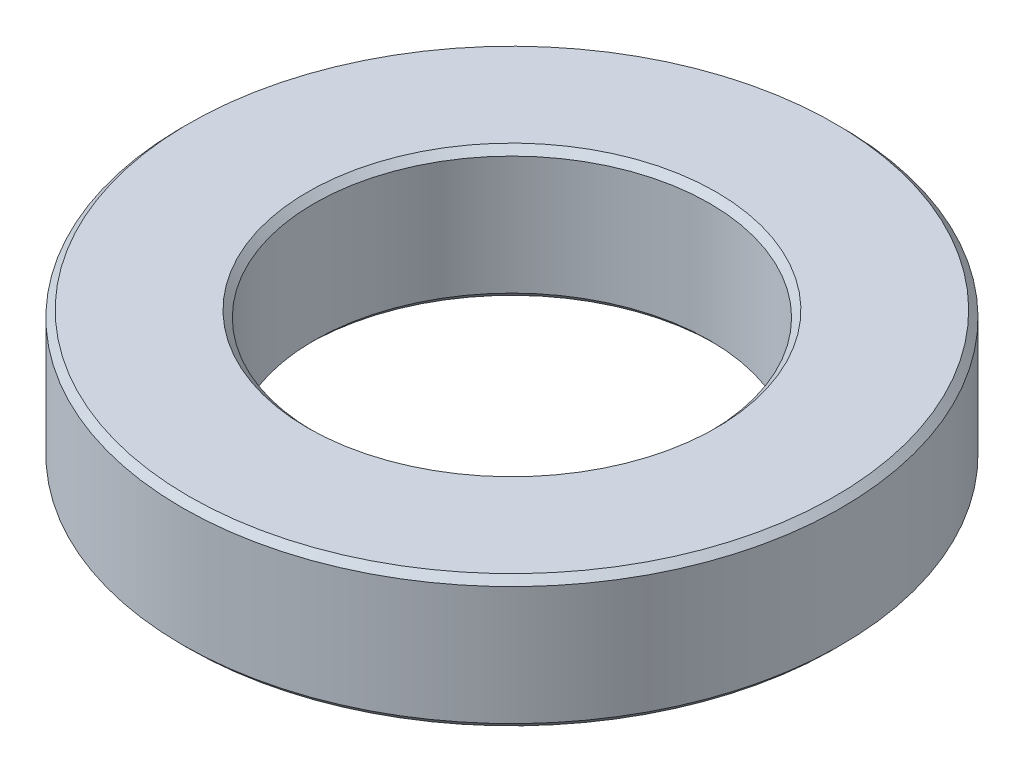
ISO-10303-21;
HEADER;
FILE_DESCRIPTION(('STEP AP214'),'2;1');
FILE_NAME('part.step','',(''),(''),'','','');
FILE_SCHEMA(('AUTOMOTIVE_DESIGN { 1 0 10303 214 1 1 1 1 }'));
ENDSEC;
DATA;
#1=APPLICATION_CONTEXT('core data for automotive mechanical design processes');
#2=APPLICATION_PROTOCOL_DEFINITION('international standard','automotive_design',2000,#1);
#3=PRODUCT_CONTEXT('',#1,'mechanical');
#4=PRODUCT('Part','Part','',(#3));
#5=PRODUCT_RELATED_PRODUCT_CATEGORY('part','',(#4));
#6=PRODUCT_DEFINITION_FORMATION('','',#4);
#7=PRODUCT_DEFINITION_CONTEXT('part definition',#1,'design');
#8=PRODUCT_DEFINITION('design','',#6,#7);
#9=PRODUCT_DEFINITION_SHAPE('','',#8);
#10=(LENGTH_UNIT() NAMED_UNIT(*) SI_UNIT(.MILLI.,.METRE.));
#11=(NAMED_UNIT(*) PLANE_ANGLE_UNIT() SI_UNIT($,.RADIAN.));
#12=(NAMED_UNIT(*) SI_UNIT($,.STERADIAN.) SOLID_ANGLE_UNIT());
#13=UNCERTAINTY_MEASURE_WITH_UNIT(LENGTH_MEASURE(1.E-05),#10,'distance_accuracy_value','');
#14=(GEOMETRIC_REPRESENTATION_CONTEXT(3) GLOBAL_UNCERTAINTY_ASSIGNED_CONTEXT((#13)) GLOBAL_UNIT_ASSIGNED_CONTEXT((#10,
#11,#12)) REPRESENTATION_CONTEXT('',''));
#15=CARTESIAN_POINT('',(0.,0.,0.));
#16=DIRECTION('',(0.,0.,1.));
#17=DIRECTION('',(1.,0.,0.));
#18=AXIS2_PLACEMENT_3D('',#15,#16,#17);
#19=CARTESIAN_POINT('',(0.,2.,0.));
#20=DIRECTION('',(0.,1.,0.));
#21=DIRECTION('',(0.,0.,1.));
#22=AXIS2_PLACEMENT_3D('',#19,#20,#21);
#23=PLANE('',#22);
#24=CARTESIAN_POINT('',(0.,2.,0.));
#25=DIRECTION('',(0.,1.,0.));
#26=DIRECTION('',(0.,0.,1.));
#27=AXIS2_PLACEMENT_3D('',#24,#25,#26);
#28=CIRCLE('',#27,3.1);
#29=CARTESIAN_POINT('',(0.,2.,3.1));
#30=VERTEX_POINT('',#29);
#31=EDGE_CURVE('E57',#30,#30,#28,.F.);
#32=ORIENTED_EDGE('',*,*,#31,.T.);
#33=EDGE_LOOP('',(#32));
#34=FACE_BOUND('',#33,.T.);
#35=CARTESIAN_POINT('',(0.,2.,0.));
#36=DIRECTION('',(0.,1.,0.));
#37=DIRECTION('',(0.,0.,1.));
#38=AXIS2_PLACEMENT_3D('',#35,#36,#37);
#39=CIRCLE('',#38,4.9);
#40=CARTESIAN_POINT('',(0.,2.,4.9));
#41=VERTEX_POINT('',#40);
#42=EDGE_CURVE('E61',#41,#41,#39,.T.);
#43=ORIENTED_EDGE('',*,*,#42,.T.);
#44=EDGE_LOOP('',(#43));
#45=FACE_BOUND('',#44,.T.);
#46=ADVANCED_FACE('F46',(#34,#45),#23,.T.);
#47=CARTESIAN_POINT('',(0.,0.,0.));
#48=DIRECTION('',(0.,1.,0.));
#49=DIRECTION('',(0.,0.,1.));
#50=AXIS2_PLACEMENT_3D('',#47,#48,#49);
#51=PLANE('',#50);
#52=CARTESIAN_POINT('',(0.,0.,0.));
#53=DIRECTION('',(0.,1.,0.));
#54=DIRECTION('',(0.,0.,1.));
#55=AXIS2_PLACEMENT_3D('',#52,#53,#54);
#56=CIRCLE('',#55,3.1);
#57=CARTESIAN_POINT('',(0.,0.,3.1));
#58=VERTEX_POINT('',#57);
#59=EDGE_CURVE('E72',#58,#58,#56,.T.);
#60=ORIENTED_EDGE('',*,*,#59,.T.);
#61=EDGE_LOOP('',(#60));
#62=FACE_BOUND('',#61,.T.);
#63=CARTESIAN_POINT('',(0.,0.,0.));
#64=DIRECTION('',(0.,1.,0.));
#65=DIRECTION('',(0.,0.,1.));
#66=AXIS2_PLACEMENT_3D('',#63,#64,#65);
#67=CIRCLE('',#66,4.9);
#68=CARTESIAN_POINT('',(0.,0.,4.9));
#69=VERTEX_POINT('',#68);
#70=EDGE_CURVE('E75',#69,#69,#67,.F.);
#71=ORIENTED_EDGE('',*,*,#70,.T.);
#72=EDGE_LOOP('',(#71));
#73=FACE_BOUND('',#72,.T.);
#74=ADVANCED_FACE('F79',(#62,#73),#51,.F.);
#75=CARTESIAN_POINT('',(0.,2.,0.));
#76=DIRECTION('',(0.,-1.,0.));
#77=DIRECTION('',(0.,0.,-1.));
#78=AXIS2_PLACEMENT_3D('',#75,#76,#77);
#79=CYLINDRICAL_SURFACE('',#78,5.);
#80=CARTESIAN_POINT('',(0.,0.0999999999999994,0.));
#81=DIRECTION('',(0.,1.,0.));
#82=DIRECTION('',(0.,0.,1.));
#83=AXIS2_PLACEMENT_3D('',#80,#81,#82);
#84=CIRCLE('',#83,5.);
#85=CARTESIAN_POINT('',(0.,0.0999999999999994,5.));
#86=VERTEX_POINT('',#85);
#87=EDGE_CURVE('E12',#86,#86,#84,.T.);
#88=ORIENTED_EDGE('',*,*,#87,.T.);
#89=EDGE_LOOP('',(#88));
#90=FACE_BOUND('',#89,.T.);
#91=CARTESIAN_POINT('',(0.,1.9,0.));
#92=DIRECTION('',(0.,1.,0.));
#93=DIRECTION('',(0.,0.,1.));
#94=AXIS2_PLACEMENT_3D('',#91,#92,#93);
#95=CIRCLE('',#94,5.);
#96=CARTESIAN_POINT('',(0.,1.9,5.));
#97=VERTEX_POINT('',#96);
#98=EDGE_CURVE('E53',#97,#97,#95,.F.);
#99=ORIENTED_EDGE('',*,*,#98,.T.);
#100=EDGE_LOOP('',(#99));
#101=FACE_BOUND('',#100,.T.);
#102=ADVANCED_FACE('F99',(#90,#101),#79,.T.);
#103=CARTESIAN_POINT('',(0.,2.,0.));
#104=DIRECTION('',(0.,-1.,0.));
#105=DIRECTION('',(0.,0.,-1.));
#106=AXIS2_PLACEMENT_3D('',#103,#104,#105);
#107=CYLINDRICAL_SURFACE('',#106,3.);
#108=CARTESIAN_POINT('',(0.,0.0999999999999985,0.));
#109=DIRECTION('',(0.,1.,0.));
#110=DIRECTION('',(0.,0.,1.));
#111=AXIS2_PLACEMENT_3D('',#108,#109,#110);
#112=CIRCLE('',#111,3.);
#113=CARTESIAN_POINT('',(0.,0.0999999999999985,3.));
#114=VERTEX_POINT('',#113);
#115=EDGE_CURVE('E66',#114,#114,#112,.F.);
#116=ORIENTED_EDGE('',*,*,#115,.T.);
#117=EDGE_LOOP('',(#116));
#118=FACE_BOUND('',#117,.T.);
#119=CARTESIAN_POINT('',(0.,1.9,0.));
#120=DIRECTION('',(0.,1.,0.));
#121=DIRECTION('',(0.,0.,1.));
#122=AXIS2_PLACEMENT_3D('',#119,#120,#121);
#123=CIRCLE('',#122,3.);
#124=CARTESIAN_POINT('',(0.,1.9,3.));
#125=VERTEX_POINT('',#124);
#126=EDGE_CURVE('E69',#125,#125,#123,.T.);
#127=ORIENTED_EDGE('',*,*,#126,.T.);
#128=EDGE_LOOP('',(#127));
#129=FACE_BOUND('',#128,.T.);
#130=ADVANCED_FACE('F104',(#118,#129),#107,.F.);
#131=CARTESIAN_POINT('',(0.,0.,0.));
#132=DIRECTION('',(0.,-1.,0.));
#133=DIRECTION('',(0.,0.,-1.));
#134=AXIS2_PLACEMENT_3D('',#131,#132,#133);
#135=CONICAL_SURFACE('',#134,3.1,0.785398163397448);
#136=ORIENTED_EDGE('',*,*,#115,.F.);
#137=EDGE_LOOP('',(#136));
#138=FACE_BOUND('',#137,.T.);
#139=ORIENTED_EDGE('',*,*,#59,.F.);
#140=EDGE_LOOP('',(#139));
#141=FACE_BOUND('',#140,.T.);
#142=ADVANCED_FACE('F90',(#138,#141),#135,.F.);
#143=CARTESIAN_POINT('',(0.,1.9,0.));
#144=DIRECTION('',(0.,1.,0.));
#145=DIRECTION('',(0.,0.,1.));
#146=AXIS2_PLACEMENT_3D('',#143,#144,#145);
#147=CONICAL_SURFACE('',#146,3.,0.785398163397453);
#148=ORIENTED_EDGE('',*,*,#31,.F.);
#149=EDGE_LOOP('',(#148));
#150=FACE_BOUND('',#149,.T.);
#151=ORIENTED_EDGE('',*,*,#126,.F.);
#152=EDGE_LOOP('',(#151));
#153=FACE_BOUND('',#152,.T.);
#154=ADVANCED_FACE('F84',(#150,#153),#147,.F.);
#155=CARTESIAN_POINT('',(0.,0.0999999999999994,0.));
#156=DIRECTION('',(0.,1.,0.));
#157=DIRECTION('',(0.,0.,1.));
#158=AXIS2_PLACEMENT_3D('',#155,#156,#157);
#159=CONICAL_SURFACE('',#158,5.,0.785398163397448);
#160=ORIENTED_EDGE('',*,*,#70,.F.);
#161=EDGE_LOOP('',(#160));
#162=FACE_BOUND('',#161,.T.);
#163=ORIENTED_EDGE('',*,*,#87,.F.);
#164=EDGE_LOOP('',(#163));
#165=FACE_BOUND('',#164,.T.);
#166=ADVANCED_FACE('F81',(#162,#165),#159,.T.);
#167=CARTESIAN_POINT('',(0.,2.,0.));
#168=DIRECTION('',(0.,-1.,0.));
#169=DIRECTION('',(0.,0.,-1.));
#170=AXIS2_PLACEMENT_3D('',#167,#168,#169);
#171=CONICAL_SURFACE('',#170,4.9,0.785398163397448);
#172=ORIENTED_EDGE('',*,*,#98,.F.);
#173=EDGE_LOOP('',(#172));
#174=FACE_BOUND('',#173,.T.);
#175=ORIENTED_EDGE('',*,*,#42,.F.);
#176=EDGE_LOOP('',(#175));
#177=FACE_BOUND('',#176,.T.);
#178=ADVANCED_FACE('F48',(#174,#177),#171,.T.);
#179=CLOSED_SHELL('',(#46,#74,#102,#130,#142,#154,#166,#178));
#180=MANIFOLD_SOLID_BREP('B2',#179);
#181=ADVANCED_BREP_SHAPE_REPRESENTATION('',(#18,#180),#14);
#182=SHAPE_DEFINITION_REPRESENTATION(#9,#181);
ENDSEC;
END-ISO-10303-21;
